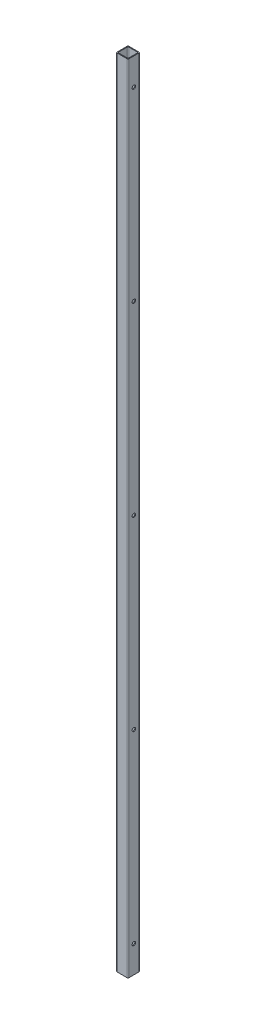
ISO-10303-21;
HEADER;
FILE_DESCRIPTION(('STEP AP214'),'2;1');
FILE_NAME('part.step','',(''),(''),'','','');
FILE_SCHEMA(('AUTOMOTIVE_DESIGN { 1 0 10303 214 1 1 1 1 }'));
ENDSEC;
DATA;
#1=APPLICATION_CONTEXT('core data for automotive mechanical design processes');
#2=APPLICATION_PROTOCOL_DEFINITION('international standard','automotive_design',2000,#1);
#3=PRODUCT_CONTEXT('',#1,'mechanical');
#4=PRODUCT('Part','Part','',(#3));
#5=PRODUCT_RELATED_PRODUCT_CATEGORY('part','',(#4));
#6=PRODUCT_DEFINITION_FORMATION('','',#4);
#7=PRODUCT_DEFINITION_CONTEXT('part definition',#1,'design');
#8=PRODUCT_DEFINITION('design','',#6,#7);
#9=PRODUCT_DEFINITION_SHAPE('','',#8);
#10=(LENGTH_UNIT() NAMED_UNIT(*) SI_UNIT(.MILLI.,.METRE.));
#11=(NAMED_UNIT(*) PLANE_ANGLE_UNIT() SI_UNIT($,.RADIAN.));
#12=(NAMED_UNIT(*) SI_UNIT($,.STERADIAN.) SOLID_ANGLE_UNIT());
#13=UNCERTAINTY_MEASURE_WITH_UNIT(LENGTH_MEASURE(1.E-05),#10,'distance_accuracy_value','');
#14=(GEOMETRIC_REPRESENTATION_CONTEXT(3) GLOBAL_UNCERTAINTY_ASSIGNED_CONTEXT((#13)) GLOBAL_UNIT_ASSIGNED_CONTEXT((#10,
#11,#12)) REPRESENTATION_CONTEXT('',''));
#15=CARTESIAN_POINT('',(0.,0.,0.));
#16=DIRECTION('',(0.,0.,1.));
#17=DIRECTION('',(1.,0.,0.));
#18=AXIS2_PLACEMENT_3D('',#15,#16,#17);
#19=CARTESIAN_POINT('',(0.,1308.1,0.));
#20=DIRECTION('',(0.,-1.,0.));
#21=DIRECTION('',(0.,0.,-1.));
#22=AXIS2_PLACEMENT_3D('',#19,#20,#21);
#23=PLANE('',#22);
#24=DIRECTION('',(0.,0.,1.));
#25=VECTOR('',#24,1.);
#26=CARTESIAN_POINT('',(-9.652,1308.1,9.652));
#27=LINE('',#26,#25);
#28=CARTESIAN_POINT('',(-9.652,1308.1,-8.382));
#29=VERTEX_POINT('',#28);
#30=CARTESIAN_POINT('',(-9.652,1308.1,8.382));
#31=VERTEX_POINT('',#30);
#32=EDGE_CURVE('E181',#29,#31,#27,.T.);
#33=ORIENTED_EDGE('',*,*,#32,.T.);
#34=CARTESIAN_POINT('',(-8.382,1308.1,8.382));
#35=DIRECTION('',(0.,-1.,0.));
#36=DIRECTION('',(0.,0.,-1.));
#37=AXIS2_PLACEMENT_3D('',#34,#35,#36);
#38=CIRCLE('',#37,1.27);
#39=CARTESIAN_POINT('',(-8.382,1308.1,9.652));
#40=VERTEX_POINT('',#39);
#41=EDGE_CURVE('E223',#31,#40,#38,.F.);
#42=ORIENTED_EDGE('',*,*,#41,.T.);
#43=DIRECTION('',(1.,0.,0.));
#44=VECTOR('',#43,1.);
#45=CARTESIAN_POINT('',(-9.652,1308.1,9.652));
#46=LINE('',#45,#44);
#47=CARTESIAN_POINT('',(8.382,1308.1,9.652));
#48=VERTEX_POINT('',#47);
#49=EDGE_CURVE('E176',#40,#48,#46,.T.);
#50=ORIENTED_EDGE('',*,*,#49,.T.);
#51=CARTESIAN_POINT('',(8.382,1308.1,8.382));
#52=DIRECTION('',(0.,-1.,0.));
#53=DIRECTION('',(0.,0.,-1.));
#54=AXIS2_PLACEMENT_3D('',#51,#52,#53);
#55=CIRCLE('',#54,1.27);
#56=CARTESIAN_POINT('',(9.652,1308.1,8.382));
#57=VERTEX_POINT('',#56);
#58=EDGE_CURVE('E218',#48,#57,#55,.F.);
#59=ORIENTED_EDGE('',*,*,#58,.T.);
#60=DIRECTION('',(0.,0.,-1.));
#61=VECTOR('',#60,1.);
#62=CARTESIAN_POINT('',(9.652,1308.1,9.652));
#63=LINE('',#62,#61);
#64=CARTESIAN_POINT('',(9.652,1308.1,-8.382));
#65=VERTEX_POINT('',#64);
#66=EDGE_CURVE('E314',#57,#65,#63,.T.);
#67=ORIENTED_EDGE('',*,*,#66,.T.);
#68=CARTESIAN_POINT('',(8.382,1308.1,-8.382));
#69=DIRECTION('',(0.,-1.,0.));
#70=DIRECTION('',(0.,0.,-1.));
#71=AXIS2_PLACEMENT_3D('',#68,#69,#70);
#72=CIRCLE('',#71,1.27);
#73=CARTESIAN_POINT('',(8.382,1308.1,-9.652));
#74=VERTEX_POINT('',#73);
#75=EDGE_CURVE('E59',#65,#74,#72,.F.);
#76=ORIENTED_EDGE('',*,*,#75,.T.);
#77=DIRECTION('',(-1.,0.,0.));
#78=VECTOR('',#77,1.);
#79=CARTESIAN_POINT('',(-9.652,1308.1,-9.652));
#80=LINE('',#79,#78);
#81=CARTESIAN_POINT('',(-8.382,1308.1,-9.652));
#82=VERTEX_POINT('',#81);
#83=EDGE_CURVE('E316',#74,#82,#80,.T.);
#84=ORIENTED_EDGE('',*,*,#83,.T.);
#85=CARTESIAN_POINT('',(-8.382,1308.1,-8.382));
#86=DIRECTION('',(0.,-1.,0.));
#87=DIRECTION('',(0.,0.,-1.));
#88=AXIS2_PLACEMENT_3D('',#85,#86,#87);
#89=CIRCLE('',#88,1.27);
#90=EDGE_CURVE('E221',#82,#29,#89,.F.);
#91=ORIENTED_EDGE('',*,*,#90,.T.);
#92=EDGE_LOOP('',(#33,#42,#50,#59,#67,#76,#84,#91));
#93=FACE_BOUND('',#92,.T.);
#94=DIRECTION('',(1.,0.,0.));
#95=VECTOR('',#94,1.);
#96=CARTESIAN_POINT('',(-8.382,1308.1,8.382));
#97=LINE('',#96,#95);
#98=CARTESIAN_POINT('',(-7.112,1308.1,8.382));
#99=VERTEX_POINT('',#98);
#100=CARTESIAN_POINT('',(7.112,1308.1,8.382));
#101=VERTEX_POINT('',#100);
#102=EDGE_CURVE('E297',#99,#101,#97,.T.);
#103=ORIENTED_EDGE('',*,*,#102,.F.);
#104=CARTESIAN_POINT('',(-7.112,1308.1,7.112));
#105=DIRECTION('',(0.,-1.,0.));
#106=DIRECTION('',(0.,0.,-1.));
#107=AXIS2_PLACEMENT_3D('',#104,#105,#106);
#108=CIRCLE('',#107,1.27);
#109=CARTESIAN_POINT('',(-8.382,1308.1,7.112));
#110=VERTEX_POINT('',#109);
#111=EDGE_CURVE('E11',#99,#110,#108,.T.);
#112=ORIENTED_EDGE('',*,*,#111,.T.);
#113=DIRECTION('',(0.,0.,1.));
#114=VECTOR('',#113,1.);
#115=CARTESIAN_POINT('',(-8.382,1308.1,8.382));
#116=LINE('',#115,#114);
#117=CARTESIAN_POINT('',(-8.382,1308.1,-7.11199999999999));
#118=VERTEX_POINT('',#117);
#119=EDGE_CURVE('E305',#118,#110,#116,.T.);
#120=ORIENTED_EDGE('',*,*,#119,.F.);
#121=CARTESIAN_POINT('',(-7.112,1308.1,-7.112));
#122=DIRECTION('',(0.,-1.,0.));
#123=DIRECTION('',(0.,0.,-1.));
#124=AXIS2_PLACEMENT_3D('',#121,#122,#123);
#125=CIRCLE('',#124,1.27);
#126=CARTESIAN_POINT('',(-7.112,1308.1,-8.382));
#127=VERTEX_POINT('',#126);
#128=EDGE_CURVE('E236',#118,#127,#125,.T.);
#129=ORIENTED_EDGE('',*,*,#128,.T.);
#130=DIRECTION('',(-1.,0.,0.));
#131=VECTOR('',#130,1.);
#132=CARTESIAN_POINT('',(-8.382,1308.1,-8.382));
#133=LINE('',#132,#131);
#134=CARTESIAN_POINT('',(7.112,1308.1,-8.382));
#135=VERTEX_POINT('',#134);
#136=EDGE_CURVE('E303',#135,#127,#133,.T.);
#137=ORIENTED_EDGE('',*,*,#136,.F.);
#138=CARTESIAN_POINT('',(7.112,1308.1,-7.112));
#139=DIRECTION('',(0.,-1.,0.));
#140=DIRECTION('',(0.,0.,-1.));
#141=AXIS2_PLACEMENT_3D('',#138,#139,#140);
#142=CIRCLE('',#141,1.27);
#143=CARTESIAN_POINT('',(8.382,1308.1,-7.11199999999999));
#144=VERTEX_POINT('',#143);
#145=EDGE_CURVE('E161',#135,#144,#142,.T.);
#146=ORIENTED_EDGE('',*,*,#145,.T.);
#147=DIRECTION('',(0.,0.,-1.));
#148=VECTOR('',#147,1.);
#149=CARTESIAN_POINT('',(8.382,1308.1,8.382));
#150=LINE('',#149,#148);
#151=CARTESIAN_POINT('',(8.382,1308.1,7.112));
#152=VERTEX_POINT('',#151);
#153=EDGE_CURVE('E300',#152,#144,#150,.T.);
#154=ORIENTED_EDGE('',*,*,#153,.F.);
#155=CARTESIAN_POINT('',(7.112,1308.1,7.112));
#156=DIRECTION('',(0.,-1.,0.));
#157=DIRECTION('',(0.,0.,-1.));
#158=AXIS2_PLACEMENT_3D('',#155,#156,#157);
#159=CIRCLE('',#158,1.27);
#160=EDGE_CURVE('E162',#152,#101,#159,.T.);
#161=ORIENTED_EDGE('',*,*,#160,.T.);
#162=EDGE_LOOP('',(#103,#112,#120,#129,#137,#146,#154,#161));
#163=FACE_BOUND('',#162,.T.);
#164=ADVANCED_FACE('F35',(#93,#163),#23,.F.);
#165=CARTESIAN_POINT('',(0.,0.,0.));
#166=DIRECTION('',(0.,-1.,0.));
#167=DIRECTION('',(0.,0.,-1.));
#168=AXIS2_PLACEMENT_3D('',#165,#166,#167);
#169=PLANE('',#168);
#170=DIRECTION('',(1.,0.,0.));
#171=VECTOR('',#170,1.);
#172=CARTESIAN_POINT('',(-9.652,0.,9.652));
#173=LINE('',#172,#171);
#174=CARTESIAN_POINT('',(-8.382,0.,9.652));
#175=VERTEX_POINT('',#174);
#176=CARTESIAN_POINT('',(8.382,0.,9.652));
#177=VERTEX_POINT('',#176);
#178=EDGE_CURVE('E184',#175,#177,#173,.T.);
#179=ORIENTED_EDGE('',*,*,#178,.F.);
#180=CARTESIAN_POINT('',(-8.382,0.,8.382));
#181=DIRECTION('',(0.,-1.,0.));
#182=DIRECTION('',(0.,0.,-1.));
#183=AXIS2_PLACEMENT_3D('',#180,#181,#182);
#184=CIRCLE('',#183,1.27);
#185=CARTESIAN_POINT('',(-9.652,0.,8.382));
#186=VERTEX_POINT('',#185);
#187=EDGE_CURVE('E211',#175,#186,#184,.T.);
#188=ORIENTED_EDGE('',*,*,#187,.T.);
#189=DIRECTION('',(0.,0.,1.));
#190=VECTOR('',#189,1.);
#191=CARTESIAN_POINT('',(-9.652,0.,9.652));
#192=LINE('',#191,#190);
#193=CARTESIAN_POINT('',(-9.652,0.,-8.382));
#194=VERTEX_POINT('',#193);
#195=EDGE_CURVE('E323',#194,#186,#192,.T.);
#196=ORIENTED_EDGE('',*,*,#195,.F.);
#197=CARTESIAN_POINT('',(-8.382,0.,-8.382));
#198=DIRECTION('',(0.,-1.,0.));
#199=DIRECTION('',(0.,0.,-1.));
#200=AXIS2_PLACEMENT_3D('',#197,#198,#199);
#201=CIRCLE('',#200,1.27);
#202=CARTESIAN_POINT('',(-8.382,0.,-9.652));
#203=VERTEX_POINT('',#202);
#204=EDGE_CURVE('E209',#194,#203,#201,.T.);
#205=ORIENTED_EDGE('',*,*,#204,.T.);
#206=DIRECTION('',(-1.,0.,0.));
#207=VECTOR('',#206,1.);
#208=CARTESIAN_POINT('',(-9.652,0.,-9.652));
#209=LINE('',#208,#207);
#210=CARTESIAN_POINT('',(8.382,0.,-9.652));
#211=VERTEX_POINT('',#210);
#212=EDGE_CURVE('E322',#211,#203,#209,.T.);
#213=ORIENTED_EDGE('',*,*,#212,.F.);
#214=CARTESIAN_POINT('',(8.382,0.,-8.382));
#215=DIRECTION('',(0.,-1.,0.));
#216=DIRECTION('',(0.,0.,-1.));
#217=AXIS2_PLACEMENT_3D('',#214,#215,#216);
#218=CIRCLE('',#217,1.27);
#219=CARTESIAN_POINT('',(9.652,0.,-8.382));
#220=VERTEX_POINT('',#219);
#221=EDGE_CURVE('E207',#211,#220,#218,.T.);
#222=ORIENTED_EDGE('',*,*,#221,.T.);
#223=DIRECTION('',(0.,0.,-1.));
#224=VECTOR('',#223,1.);
#225=CARTESIAN_POINT('',(9.652,0.,9.652));
#226=LINE('',#225,#224);
#227=CARTESIAN_POINT('',(9.652,0.,8.382));
#228=VERTEX_POINT('',#227);
#229=EDGE_CURVE('E308',#228,#220,#226,.T.);
#230=ORIENTED_EDGE('',*,*,#229,.F.);
#231=CARTESIAN_POINT('',(8.382,0.,8.382));
#232=DIRECTION('',(0.,-1.,0.));
#233=DIRECTION('',(0.,0.,-1.));
#234=AXIS2_PLACEMENT_3D('',#231,#232,#233);
#235=CIRCLE('',#234,1.27);
#236=EDGE_CURVE('E205',#228,#177,#235,.T.);
#237=ORIENTED_EDGE('',*,*,#236,.T.);
#238=EDGE_LOOP('',(#179,#188,#196,#205,#213,#222,#230,#237));
#239=FACE_BOUND('',#238,.T.);
#240=DIRECTION('',(-1.,0.,0.));
#241=VECTOR('',#240,1.);
#242=CARTESIAN_POINT('',(-8.382,0.,-8.382));
#243=LINE('',#242,#241);
#244=CARTESIAN_POINT('',(7.112,0.,-8.382));
#245=VERTEX_POINT('',#244);
#246=CARTESIAN_POINT('',(-7.112,0.,-8.382));
#247=VERTEX_POINT('',#246);
#248=EDGE_CURVE('E154',#245,#247,#243,.T.);
#249=ORIENTED_EDGE('',*,*,#248,.T.);
#250=CARTESIAN_POINT('',(-7.112,0.,-7.112));
#251=DIRECTION('',(0.,-1.,0.));
#252=DIRECTION('',(0.,0.,-1.));
#253=AXIS2_PLACEMENT_3D('',#250,#251,#252);
#254=CIRCLE('',#253,1.27);
#255=CARTESIAN_POINT('',(-8.382,0.,-7.11199999999999));
#256=VERTEX_POINT('',#255);
#257=EDGE_CURVE('E234',#247,#256,#254,.F.);
#258=ORIENTED_EDGE('',*,*,#257,.T.);
#259=DIRECTION('',(0.,0.,1.));
#260=VECTOR('',#259,1.);
#261=CARTESIAN_POINT('',(-8.382,0.,8.382));
#262=LINE('',#261,#260);
#263=CARTESIAN_POINT('',(-8.382,0.,7.112));
#264=VERTEX_POINT('',#263);
#265=EDGE_CURVE('E172',#256,#264,#262,.T.);
#266=ORIENTED_EDGE('',*,*,#265,.T.);
#267=CARTESIAN_POINT('',(-7.112,0.,7.112));
#268=DIRECTION('',(0.,-1.,0.));
#269=DIRECTION('',(0.,0.,-1.));
#270=AXIS2_PLACEMENT_3D('',#267,#268,#269);
#271=CIRCLE('',#270,1.27);
#272=CARTESIAN_POINT('',(-7.112,0.,8.382));
#273=VERTEX_POINT('',#272);
#274=EDGE_CURVE('E44',#264,#273,#271,.F.);
#275=ORIENTED_EDGE('',*,*,#274,.T.);
#276=DIRECTION('',(1.,0.,0.));
#277=VECTOR('',#276,1.);
#278=CARTESIAN_POINT('',(-8.382,0.,8.382));
#279=LINE('',#278,#277);
#280=CARTESIAN_POINT('',(7.112,0.,8.382));
#281=VERTEX_POINT('',#280);
#282=EDGE_CURVE('E296',#273,#281,#279,.T.);
#283=ORIENTED_EDGE('',*,*,#282,.T.);
#284=CARTESIAN_POINT('',(7.112,0.,7.112));
#285=DIRECTION('',(0.,-1.,0.));
#286=DIRECTION('',(0.,0.,-1.));
#287=AXIS2_PLACEMENT_3D('',#284,#285,#286);
#288=CIRCLE('',#287,1.27);
#289=CARTESIAN_POINT('',(8.382,0.,7.112));
#290=VERTEX_POINT('',#289);
#291=EDGE_CURVE('E238',#281,#290,#288,.F.);
#292=ORIENTED_EDGE('',*,*,#291,.T.);
#293=DIRECTION('',(0.,0.,-1.));
#294=VECTOR('',#293,1.);
#295=CARTESIAN_POINT('',(8.382,0.,8.382));
#296=LINE('',#295,#294);
#297=CARTESIAN_POINT('',(8.382,0.,-7.11199999999999));
#298=VERTEX_POINT('',#297);
#299=EDGE_CURVE('E156',#290,#298,#296,.T.);
#300=ORIENTED_EDGE('',*,*,#299,.T.);
#301=CARTESIAN_POINT('',(7.112,0.,-7.112));
#302=DIRECTION('',(0.,-1.,0.));
#303=DIRECTION('',(0.,0.,-1.));
#304=AXIS2_PLACEMENT_3D('',#301,#302,#303);
#305=CIRCLE('',#304,1.27);
#306=EDGE_CURVE('E151',#298,#245,#305,.F.);
#307=ORIENTED_EDGE('',*,*,#306,.T.);
#308=EDGE_LOOP('',(#249,#258,#266,#275,#283,#292,#300,#307));
#309=FACE_BOUND('',#308,.T.);
#310=ADVANCED_FACE('F153',(#239,#309),#169,.T.);
#311=CARTESIAN_POINT('',(9.652,1308.1,9.652));
#312=DIRECTION('',(-1.,0.,0.));
#313=DIRECTION('',(0.,0.,1.));
#314=AXIS2_PLACEMENT_3D('',#311,#312,#313);
#315=PLANE('',#314);
#316=CARTESIAN_POINT('',(9.652,1263.65,0.));
#317=DIRECTION('',(1.,0.,0.));
#318=DIRECTION('',(0.,0.,-1.));
#319=AXIS2_PLACEMENT_3D('',#316,#317,#318);
#320=CIRCLE('',#319,2.8956);
#321=CARTESIAN_POINT('',(9.652,1263.65,-2.8956));
#322=VERTEX_POINT('',#321);
#323=EDGE_CURVE('E631',#322,#322,#320,.T.);
#324=ORIENTED_EDGE('',*,*,#323,.F.);
#325=EDGE_LOOP('',(#324));
#326=FACE_BOUND('',#325,.T.);
#327=CARTESIAN_POINT('',(9.652,958.85,0.));
#328=DIRECTION('',(1.,0.,0.));
#329=DIRECTION('',(0.,0.,-1.));
#330=AXIS2_PLACEMENT_3D('',#327,#328,#329);
#331=CIRCLE('',#330,2.8956);
#332=CARTESIAN_POINT('',(9.652,958.85,-2.8956));
#333=VERTEX_POINT('',#332);
#334=EDGE_CURVE('E267',#333,#333,#331,.T.);
#335=ORIENTED_EDGE('',*,*,#334,.F.);
#336=EDGE_LOOP('',(#335));
#337=FACE_BOUND('',#336,.T.);
#338=CARTESIAN_POINT('',(9.652,654.05,0.));
#339=DIRECTION('',(1.,0.,0.));
#340=DIRECTION('',(0.,0.,-1.));
#341=AXIS2_PLACEMENT_3D('',#338,#339,#340);
#342=CIRCLE('',#341,2.8956);
#343=CARTESIAN_POINT('',(9.652,654.05,-2.8956));
#344=VERTEX_POINT('',#343);
#345=EDGE_CURVE('E264',#344,#344,#342,.T.);
#346=ORIENTED_EDGE('',*,*,#345,.F.);
#347=EDGE_LOOP('',(#346));
#348=FACE_BOUND('',#347,.T.);
#349=CARTESIAN_POINT('',(9.652,349.25,0.));
#350=DIRECTION('',(1.,0.,0.));
#351=DIRECTION('',(0.,0.,-1.));
#352=AXIS2_PLACEMENT_3D('',#349,#350,#351);
#353=CIRCLE('',#352,2.8956);
#354=CARTESIAN_POINT('',(9.652,349.25,-2.8956));
#355=VERTEX_POINT('',#354);
#356=EDGE_CURVE('E282',#355,#355,#353,.T.);
#357=ORIENTED_EDGE('',*,*,#356,.F.);
#358=EDGE_LOOP('',(#357));
#359=FACE_BOUND('',#358,.T.);
#360=CARTESIAN_POINT('',(9.652,44.4500000000001,0.));
#361=DIRECTION('',(1.,0.,0.));
#362=DIRECTION('',(0.,0.,-1.));
#363=AXIS2_PLACEMENT_3D('',#360,#361,#362);
#364=CIRCLE('',#363,2.89559999999998);
#365=CARTESIAN_POINT('',(9.652,44.4500000000001,-2.89559999999999));
#366=VERTEX_POINT('',#365);
#367=EDGE_CURVE('E289',#366,#366,#364,.T.);
#368=ORIENTED_EDGE('',*,*,#367,.F.);
#369=EDGE_LOOP('',(#368));
#370=FACE_BOUND('',#369,.T.);
#371=ORIENTED_EDGE('',*,*,#229,.T.);
#372=DIRECTION('',(0.,-1.,0.));
#373=VECTOR('',#372,1.);
#374=CARTESIAN_POINT('',(9.652,1308.1,-8.382));
#375=LINE('',#374,#373);
#376=EDGE_CURVE('E232',#220,#65,#375,.F.);
#377=ORIENTED_EDGE('',*,*,#376,.T.);
#378=ORIENTED_EDGE('',*,*,#66,.F.);
#379=DIRECTION('',(0.,-1.,0.));
#380=VECTOR('',#379,1.);
#381=CARTESIAN_POINT('',(9.652,1308.1,8.382));
#382=LINE('',#381,#380);
#383=EDGE_CURVE('E229',#57,#228,#382,.T.);
#384=ORIENTED_EDGE('',*,*,#383,.T.);
#385=EDGE_LOOP('',(#371,#377,#378,#384));
#386=FACE_BOUND('',#385,.T.);
#387=ADVANCED_FACE('F342',(#326,#337,#348,#359,#370,#386),#315,.F.);
#388=CARTESIAN_POINT('',(-9.652,1308.1,-9.652));
#389=DIRECTION('',(0.,0.,1.));
#390=DIRECTION('',(1.,0.,0.));
#391=AXIS2_PLACEMENT_3D('',#388,#389,#390);
#392=PLANE('',#391);
#393=ORIENTED_EDGE('',*,*,#212,.T.);
#394=DIRECTION('',(0.,-1.,0.));
#395=VECTOR('',#394,1.);
#396=CARTESIAN_POINT('',(-8.382,1308.1,-9.652));
#397=LINE('',#396,#395);
#398=EDGE_CURVE('E52',#203,#82,#397,.F.);
#399=ORIENTED_EDGE('',*,*,#398,.T.);
#400=ORIENTED_EDGE('',*,*,#83,.F.);
#401=DIRECTION('',(0.,-1.,0.));
#402=VECTOR('',#401,1.);
#403=CARTESIAN_POINT('',(8.382,1308.1,-9.652));
#404=LINE('',#403,#402);
#405=EDGE_CURVE('E225',#74,#211,#404,.T.);
#406=ORIENTED_EDGE('',*,*,#405,.T.);
#407=EDGE_LOOP('',(#393,#399,#400,#406));
#408=FACE_BOUND('',#407,.T.);
#409=ADVANCED_FACE('F349',(#408),#392,.F.);
#410=CARTESIAN_POINT('',(-9.652,1308.1,9.652));
#411=DIRECTION('',(1.,0.,0.));
#412=DIRECTION('',(0.,0.,-1.));
#413=AXIS2_PLACEMENT_3D('',#410,#411,#412);
#414=PLANE('',#413);
#415=CARTESIAN_POINT('',(-9.652,1263.65,0.));
#416=DIRECTION('',(1.,0.,0.));
#417=DIRECTION('',(0.,0.,-1.));
#418=AXIS2_PLACEMENT_3D('',#415,#416,#417);
#419=CIRCLE('',#418,2.8956);
#420=CARTESIAN_POINT('',(-9.652,1263.65,-2.8956));
#421=VERTEX_POINT('',#420);
#422=EDGE_CURVE('E632',#421,#421,#419,.T.);
#423=ORIENTED_EDGE('',*,*,#422,.T.);
#424=EDGE_LOOP('',(#423));
#425=FACE_BOUND('',#424,.T.);
#426=CARTESIAN_POINT('',(-9.652,958.85,0.));
#427=DIRECTION('',(1.,0.,0.));
#428=DIRECTION('',(0.,0.,-1.));
#429=AXIS2_PLACEMENT_3D('',#426,#427,#428);
#430=CIRCLE('',#429,2.8956);
#431=CARTESIAN_POINT('',(-9.652,958.85,-2.8956));
#432=VERTEX_POINT('',#431);
#433=EDGE_CURVE('E260',#432,#432,#430,.T.);
#434=ORIENTED_EDGE('',*,*,#433,.T.);
#435=EDGE_LOOP('',(#434));
#436=FACE_BOUND('',#435,.T.);
#437=CARTESIAN_POINT('',(-9.652,654.05,0.));
#438=DIRECTION('',(1.,0.,0.));
#439=DIRECTION('',(0.,0.,-1.));
#440=AXIS2_PLACEMENT_3D('',#437,#438,#439);
#441=CIRCLE('',#440,2.8956);
#442=CARTESIAN_POINT('',(-9.652,654.05,-2.8956));
#443=VERTEX_POINT('',#442);
#444=EDGE_CURVE('E256',#443,#443,#441,.T.);
#445=ORIENTED_EDGE('',*,*,#444,.T.);
#446=EDGE_LOOP('',(#445));
#447=FACE_BOUND('',#446,.T.);
#448=CARTESIAN_POINT('',(-9.652,349.25,0.));
#449=DIRECTION('',(1.,0.,0.));
#450=DIRECTION('',(0.,0.,-1.));
#451=AXIS2_PLACEMENT_3D('',#448,#449,#450);
#452=CIRCLE('',#451,2.8956);
#453=CARTESIAN_POINT('',(-9.652,349.25,-2.8956));
#454=VERTEX_POINT('',#453);
#455=EDGE_CURVE('E252',#454,#454,#452,.T.);
#456=ORIENTED_EDGE('',*,*,#455,.T.);
#457=EDGE_LOOP('',(#456));
#458=FACE_BOUND('',#457,.T.);
#459=CARTESIAN_POINT('',(-9.652,44.4500000000001,0.));
#460=DIRECTION('',(1.,0.,0.));
#461=DIRECTION('',(0.,0.,-1.));
#462=AXIS2_PLACEMENT_3D('',#459,#460,#461);
#463=CIRCLE('',#462,2.89559999999998);
#464=CARTESIAN_POINT('',(-9.652,44.4500000000001,-2.89559999999999));
#465=VERTEX_POINT('',#464);
#466=EDGE_CURVE('E247',#465,#465,#463,.T.);
#467=ORIENTED_EDGE('',*,*,#466,.T.);
#468=EDGE_LOOP('',(#467));
#469=FACE_BOUND('',#468,.T.);
#470=ORIENTED_EDGE('',*,*,#195,.T.);
#471=DIRECTION('',(0.,-1.,0.));
#472=VECTOR('',#471,1.);
#473=CARTESIAN_POINT('',(-9.652,1308.1,8.382));
#474=LINE('',#473,#472);
#475=EDGE_CURVE('E216',#186,#31,#474,.F.);
#476=ORIENTED_EDGE('',*,*,#475,.T.);
#477=ORIENTED_EDGE('',*,*,#32,.F.);
#478=DIRECTION('',(0.,-1.,0.));
#479=VECTOR('',#478,1.);
#480=CARTESIAN_POINT('',(-9.652,1308.1,-8.382));
#481=LINE('',#480,#479);
#482=EDGE_CURVE('E213',#29,#194,#481,.T.);
#483=ORIENTED_EDGE('',*,*,#482,.T.);
#484=EDGE_LOOP('',(#470,#476,#477,#483));
#485=FACE_BOUND('',#484,.T.);
#486=ADVANCED_FACE('F355',(#425,#436,#447,#458,#469,#485),#414,.F.);
#487=CARTESIAN_POINT('',(-9.652,1308.1,9.652));
#488=DIRECTION('',(0.,0.,-1.));
#489=DIRECTION('',(-1.,0.,0.));
#490=AXIS2_PLACEMENT_3D('',#487,#488,#489);
#491=PLANE('',#490);
#492=ORIENTED_EDGE('',*,*,#49,.F.);
#493=DIRECTION('',(0.,-1.,0.));
#494=VECTOR('',#493,1.);
#495=CARTESIAN_POINT('',(-8.382,1308.1,9.652));
#496=LINE('',#495,#494);
#497=EDGE_CURVE('E202',#40,#175,#496,.T.);
#498=ORIENTED_EDGE('',*,*,#497,.T.);
#499=ORIENTED_EDGE('',*,*,#178,.T.);
#500=DIRECTION('',(0.,-1.,0.));
#501=VECTOR('',#500,1.);
#502=CARTESIAN_POINT('',(8.382,1308.1,9.652));
#503=LINE('',#502,#501);
#504=EDGE_CURVE('E200',#177,#48,#503,.F.);
#505=ORIENTED_EDGE('',*,*,#504,.T.);
#506=EDGE_LOOP('',(#492,#498,#499,#505));
#507=FACE_BOUND('',#506,.T.);
#508=ADVANCED_FACE('F333',(#507),#491,.F.);
#509=CARTESIAN_POINT('',(-8.382,1308.1,8.382));
#510=DIRECTION('',(0.,0.,-1.));
#511=DIRECTION('',(-1.,0.,0.));
#512=AXIS2_PLACEMENT_3D('',#509,#510,#511);
#513=PLANE('',#512);
#514=ORIENTED_EDGE('',*,*,#102,.T.);
#515=DIRECTION('',(0.,-1.,0.));
#516=VECTOR('',#515,1.);
#517=CARTESIAN_POINT('',(7.112,0.,8.382));
#518=LINE('',#517,#516);
#519=EDGE_CURVE('E193',#101,#281,#518,.T.);
#520=ORIENTED_EDGE('',*,*,#519,.T.);
#521=ORIENTED_EDGE('',*,*,#282,.F.);
#522=DIRECTION('',(0.,-1.,0.));
#523=VECTOR('',#522,1.);
#524=CARTESIAN_POINT('',(-7.112,1308.1,8.382));
#525=LINE('',#524,#523);
#526=EDGE_CURVE('E191',#273,#99,#525,.F.);
#527=ORIENTED_EDGE('',*,*,#526,.T.);
#528=EDGE_LOOP('',(#514,#520,#521,#527));
#529=FACE_BOUND('',#528,.T.);
#530=ADVANCED_FACE('F376',(#529),#513,.T.);
#531=CARTESIAN_POINT('',(8.382,1308.1,8.382));
#532=DIRECTION('',(-1.,0.,0.));
#533=DIRECTION('',(0.,0.,1.));
#534=AXIS2_PLACEMENT_3D('',#531,#532,#533);
#535=PLANE('',#534);
#536=CARTESIAN_POINT('',(8.382,1263.65,0.));
#537=DIRECTION('',(-1.,0.,0.));
#538=DIRECTION('',(0.,0.,1.));
#539=AXIS2_PLACEMENT_3D('',#536,#537,#538);
#540=CIRCLE('',#539,2.8956);
#541=CARTESIAN_POINT('',(8.382,1263.65,2.89559999999999));
#542=VERTEX_POINT('',#541);
#543=EDGE_CURVE('E272',#542,#542,#540,.T.);
#544=ORIENTED_EDGE('',*,*,#543,.F.);
#545=EDGE_LOOP('',(#544));
#546=FACE_BOUND('',#545,.T.);
#547=CARTESIAN_POINT('',(8.382,958.85,0.));
#548=DIRECTION('',(-1.,0.,0.));
#549=DIRECTION('',(0.,0.,1.));
#550=AXIS2_PLACEMENT_3D('',#547,#548,#549);
#551=CIRCLE('',#550,2.8956);
#552=CARTESIAN_POINT('',(8.382,958.85,2.89559999999999));
#553=VERTEX_POINT('',#552);
#554=EDGE_CURVE('E257',#553,#553,#551,.T.);
#555=ORIENTED_EDGE('',*,*,#554,.F.);
#556=EDGE_LOOP('',(#555));
#557=FACE_BOUND('',#556,.T.);
#558=CARTESIAN_POINT('',(8.382,654.05,0.));
#559=DIRECTION('',(-1.,0.,0.));
#560=DIRECTION('',(0.,0.,1.));
#561=AXIS2_PLACEMENT_3D('',#558,#559,#560);
#562=CIRCLE('',#561,2.8956);
#563=CARTESIAN_POINT('',(8.382,654.05,2.89559999999999));
#564=VERTEX_POINT('',#563);
#565=EDGE_CURVE('E255',#564,#564,#562,.T.);
#566=ORIENTED_EDGE('',*,*,#565,.F.);
#567=EDGE_LOOP('',(#566));
#568=FACE_BOUND('',#567,.T.);
#569=CARTESIAN_POINT('',(8.382,349.25,0.));
#570=DIRECTION('',(-1.,0.,0.));
#571=DIRECTION('',(0.,0.,1.));
#572=AXIS2_PLACEMENT_3D('',#569,#570,#571);
#573=CIRCLE('',#572,2.8956);
#574=CARTESIAN_POINT('',(8.382,349.25,2.89559999999999));
#575=VERTEX_POINT('',#574);
#576=EDGE_CURVE('E248',#575,#575,#573,.T.);
#577=ORIENTED_EDGE('',*,*,#576,.F.);
#578=EDGE_LOOP('',(#577));
#579=FACE_BOUND('',#578,.T.);
#580=CARTESIAN_POINT('',(8.382,44.4500000000001,0.));
#581=DIRECTION('',(-1.,0.,0.));
#582=DIRECTION('',(0.,0.,1.));
#583=AXIS2_PLACEMENT_3D('',#580,#581,#582);
#584=CIRCLE('',#583,2.89559999999998);
#585=CARTESIAN_POINT('',(8.382,44.4500000000001,2.89559999999998));
#586=VERTEX_POINT('',#585);
#587=EDGE_CURVE('E246',#586,#586,#584,.T.);
#588=ORIENTED_EDGE('',*,*,#587,.F.);
#589=EDGE_LOOP('',(#588));
#590=FACE_BOUND('',#589,.T.);
#591=ORIENTED_EDGE('',*,*,#299,.F.);
#592=DIRECTION('',(0.,-1.,0.));
#593=VECTOR('',#592,1.);
#594=CARTESIAN_POINT('',(8.382,1308.1,7.112));
#595=LINE('',#594,#593);
#596=EDGE_CURVE('E198',#290,#152,#595,.F.);
#597=ORIENTED_EDGE('',*,*,#596,.T.);
#598=ORIENTED_EDGE('',*,*,#153,.T.);
#599=DIRECTION('',(0.,-1.,0.));
#600=VECTOR('',#599,1.);
#601=CARTESIAN_POINT('',(8.382,0.,-7.112));
#602=LINE('',#601,#600);
#603=EDGE_CURVE('E196',#144,#298,#602,.T.);
#604=ORIENTED_EDGE('',*,*,#603,.T.);
#605=EDGE_LOOP('',(#591,#597,#598,#604));
#606=FACE_BOUND('',#605,.T.);
#607=ADVANCED_FACE('F460',(#546,#557,#568,#579,#590,#606),#535,.T.);
#608=CARTESIAN_POINT('',(-8.382,1308.1,-8.382));
#609=DIRECTION('',(0.,0.,1.));
#610=DIRECTION('',(1.,0.,0.));
#611=AXIS2_PLACEMENT_3D('',#608,#609,#610);
#612=PLANE('',#611);
#613=ORIENTED_EDGE('',*,*,#136,.T.);
#614=DIRECTION('',(0.,-1.,0.));
#615=VECTOR('',#614,1.);
#616=CARTESIAN_POINT('',(-7.112,0.,-8.382));
#617=LINE('',#616,#615);
#618=EDGE_CURVE('E171',#127,#247,#617,.T.);
#619=ORIENTED_EDGE('',*,*,#618,.T.);
#620=ORIENTED_EDGE('',*,*,#248,.F.);
#621=DIRECTION('',(0.,-1.,0.));
#622=VECTOR('',#621,1.);
#623=CARTESIAN_POINT('',(7.112,1308.1,-8.382));
#624=LINE('',#623,#622);
#625=EDGE_CURVE('E168',#245,#135,#624,.F.);
#626=ORIENTED_EDGE('',*,*,#625,.T.);
#627=EDGE_LOOP('',(#613,#619,#620,#626));
#628=FACE_BOUND('',#627,.T.);
#629=ADVANCED_FACE('F167',(#628),#612,.T.);
#630=CARTESIAN_POINT('',(-8.382,1308.1,8.382));
#631=DIRECTION('',(1.,0.,0.));
#632=DIRECTION('',(0.,0.,-1.));
#633=AXIS2_PLACEMENT_3D('',#630,#631,#632);
#634=PLANE('',#633);
#635=CARTESIAN_POINT('',(-8.382,1263.65,0.));
#636=DIRECTION('',(1.,0.,0.));
#637=DIRECTION('',(0.,0.,-1.));
#638=AXIS2_PLACEMENT_3D('',#635,#636,#637);
#639=CIRCLE('',#638,2.8956);
#640=CARTESIAN_POINT('',(-8.382,1263.65,-2.8956));
#641=VERTEX_POINT('',#640);
#642=EDGE_CURVE('E39',#641,#641,#639,.T.);
#643=ORIENTED_EDGE('',*,*,#642,.F.);
#644=EDGE_LOOP('',(#643));
#645=FACE_BOUND('',#644,.T.);
#646=CARTESIAN_POINT('',(-8.382,958.85,0.));
#647=DIRECTION('',(1.,0.,0.));
#648=DIRECTION('',(0.,0.,-1.));
#649=AXIS2_PLACEMENT_3D('',#646,#647,#648);
#650=CIRCLE('',#649,2.8956);
#651=CARTESIAN_POINT('',(-8.382,958.85,-2.8956));
#652=VERTEX_POINT('',#651);
#653=EDGE_CURVE('E259',#652,#652,#650,.T.);
#654=ORIENTED_EDGE('',*,*,#653,.F.);
#655=EDGE_LOOP('',(#654));
#656=FACE_BOUND('',#655,.T.);
#657=CARTESIAN_POINT('',(-8.382,654.05,0.));
#658=DIRECTION('',(1.,0.,0.));
#659=DIRECTION('',(0.,0.,-1.));
#660=AXIS2_PLACEMENT_3D('',#657,#658,#659);
#661=CIRCLE('',#660,2.8956);
#662=CARTESIAN_POINT('',(-8.382,654.05,-2.8956));
#663=VERTEX_POINT('',#662);
#664=EDGE_CURVE('E253',#663,#663,#661,.T.);
#665=ORIENTED_EDGE('',*,*,#664,.F.);
#666=EDGE_LOOP('',(#665));
#667=FACE_BOUND('',#666,.T.);
#668=CARTESIAN_POINT('',(-8.382,349.25,0.));
#669=DIRECTION('',(1.,0.,0.));
#670=DIRECTION('',(0.,0.,-1.));
#671=AXIS2_PLACEMENT_3D('',#668,#669,#670);
#672=CIRCLE('',#671,2.8956);
#673=CARTESIAN_POINT('',(-8.382,349.25,-2.8956));
#674=VERTEX_POINT('',#673);
#675=EDGE_CURVE('E251',#674,#674,#672,.T.);
#676=ORIENTED_EDGE('',*,*,#675,.F.);
#677=EDGE_LOOP('',(#676));
#678=FACE_BOUND('',#677,.T.);
#679=CARTESIAN_POINT('',(-8.382,44.4500000000001,0.));
#680=DIRECTION('',(1.,0.,0.));
#681=DIRECTION('',(0.,0.,-1.));
#682=AXIS2_PLACEMENT_3D('',#679,#680,#681);
#683=CIRCLE('',#682,2.89559999999998);
#684=CARTESIAN_POINT('',(-8.382,44.4500000000001,-2.89559999999999));
#685=VERTEX_POINT('',#684);
#686=EDGE_CURVE('E243',#685,#685,#683,.T.);
#687=ORIENTED_EDGE('',*,*,#686,.F.);
#688=EDGE_LOOP('',(#687));
#689=FACE_BOUND('',#688,.T.);
#690=ORIENTED_EDGE('',*,*,#265,.F.);
#691=DIRECTION('',(0.,-1.,0.));
#692=VECTOR('',#691,1.);
#693=CARTESIAN_POINT('',(-8.382,1308.1,-7.112));
#694=LINE('',#693,#692);
#695=EDGE_CURVE('E189',#256,#118,#694,.F.);
#696=ORIENTED_EDGE('',*,*,#695,.T.);
#697=ORIENTED_EDGE('',*,*,#119,.T.);
#698=DIRECTION('',(0.,-1.,0.));
#699=VECTOR('',#698,1.);
#700=CARTESIAN_POINT('',(-8.382,0.,7.112));
#701=LINE('',#700,#699);
#702=EDGE_CURVE('E178',#110,#264,#701,.T.);
#703=ORIENTED_EDGE('',*,*,#702,.T.);
#704=EDGE_LOOP('',(#690,#696,#697,#703));
#705=FACE_BOUND('',#704,.T.);
#706=ADVANCED_FACE('F393',(#645,#656,#667,#678,#689,#705),#634,.T.);
#707=CARTESIAN_POINT('',(-7.112,1308.1,-7.112));
#708=DIRECTION('',(0.,1.,0.));
#709=DIRECTION('',(0.,0.,1.));
#710=AXIS2_PLACEMENT_3D('',#707,#708,#709);
#711=CYLINDRICAL_SURFACE('',#710,1.27);
#712=ORIENTED_EDGE('',*,*,#128,.F.);
#713=ORIENTED_EDGE('',*,*,#695,.F.);
#714=ORIENTED_EDGE('',*,*,#257,.F.);
#715=ORIENTED_EDGE('',*,*,#618,.F.);
#716=EDGE_LOOP('',(#712,#713,#714,#715));
#717=FACE_BOUND('',#716,.T.);
#718=ADVANCED_FACE('F389',(#717),#711,.F.);
#719=CARTESIAN_POINT('',(7.112,1308.1,7.112));
#720=DIRECTION('',(0.,1.,0.));
#721=DIRECTION('',(0.,0.,1.));
#722=AXIS2_PLACEMENT_3D('',#719,#720,#721);
#723=CYLINDRICAL_SURFACE('',#722,1.27);
#724=ORIENTED_EDGE('',*,*,#160,.F.);
#725=ORIENTED_EDGE('',*,*,#596,.F.);
#726=ORIENTED_EDGE('',*,*,#291,.F.);
#727=ORIENTED_EDGE('',*,*,#519,.F.);
#728=EDGE_LOOP('',(#724,#725,#726,#727));
#729=FACE_BOUND('',#728,.T.);
#730=ADVANCED_FACE('F392',(#729),#723,.F.);
#731=CARTESIAN_POINT('',(7.112,1308.1,-7.112));
#732=DIRECTION('',(0.,1.,0.));
#733=DIRECTION('',(0.,0.,1.));
#734=AXIS2_PLACEMENT_3D('',#731,#732,#733);
#735=CYLINDRICAL_SURFACE('',#734,1.27);
#736=ORIENTED_EDGE('',*,*,#145,.F.);
#737=ORIENTED_EDGE('',*,*,#625,.F.);
#738=ORIENTED_EDGE('',*,*,#306,.F.);
#739=ORIENTED_EDGE('',*,*,#603,.F.);
#740=EDGE_LOOP('',(#736,#737,#738,#739));
#741=FACE_BOUND('',#740,.T.);
#742=ADVANCED_FACE('F175',(#741),#735,.F.);
#743=CARTESIAN_POINT('',(-7.112,1308.1,7.112));
#744=DIRECTION('',(0.,1.,0.));
#745=DIRECTION('',(0.,0.,1.));
#746=AXIS2_PLACEMENT_3D('',#743,#744,#745);
#747=CYLINDRICAL_SURFACE('',#746,1.27);
#748=ORIENTED_EDGE('',*,*,#111,.F.);
#749=ORIENTED_EDGE('',*,*,#526,.F.);
#750=ORIENTED_EDGE('',*,*,#274,.F.);
#751=ORIENTED_EDGE('',*,*,#702,.F.);
#752=EDGE_LOOP('',(#748,#749,#750,#751));
#753=FACE_BOUND('',#752,.T.);
#754=ADVANCED_FACE('F360',(#753),#747,.F.);
#755=CARTESIAN_POINT('',(-8.382,1308.1,8.382));
#756=DIRECTION('',(0.,-1.,0.));
#757=DIRECTION('',(0.,0.,-1.));
#758=AXIS2_PLACEMENT_3D('',#755,#756,#757);
#759=CYLINDRICAL_SURFACE('',#758,1.27);
#760=ORIENTED_EDGE('',*,*,#41,.F.);
#761=ORIENTED_EDGE('',*,*,#475,.F.);
#762=ORIENTED_EDGE('',*,*,#187,.F.);
#763=ORIENTED_EDGE('',*,*,#497,.F.);
#764=EDGE_LOOP('',(#760,#761,#762,#763));
#765=FACE_BOUND('',#764,.T.);
#766=ADVANCED_FACE('F358',(#765),#759,.T.);
#767=CARTESIAN_POINT('',(-8.382,1308.1,-8.382));
#768=DIRECTION('',(0.,-1.,0.));
#769=DIRECTION('',(0.,0.,-1.));
#770=AXIS2_PLACEMENT_3D('',#767,#768,#769);
#771=CYLINDRICAL_SURFACE('',#770,1.27);
#772=ORIENTED_EDGE('',*,*,#90,.F.);
#773=ORIENTED_EDGE('',*,*,#398,.F.);
#774=ORIENTED_EDGE('',*,*,#204,.F.);
#775=ORIENTED_EDGE('',*,*,#482,.F.);
#776=EDGE_LOOP('',(#772,#773,#774,#775));
#777=FACE_BOUND('',#776,.T.);
#778=ADVANCED_FACE('F353',(#777),#771,.T.);
#779=CARTESIAN_POINT('',(8.382,1308.1,-8.382));
#780=DIRECTION('',(0.,-1.,0.));
#781=DIRECTION('',(0.,0.,-1.));
#782=AXIS2_PLACEMENT_3D('',#779,#780,#781);
#783=CYLINDRICAL_SURFACE('',#782,1.27);
#784=ORIENTED_EDGE('',*,*,#75,.F.);
#785=ORIENTED_EDGE('',*,*,#376,.F.);
#786=ORIENTED_EDGE('',*,*,#221,.F.);
#787=ORIENTED_EDGE('',*,*,#405,.F.);
#788=EDGE_LOOP('',(#784,#785,#786,#787));
#789=FACE_BOUND('',#788,.T.);
#790=ADVANCED_FACE('F346',(#789),#783,.T.);
#791=CARTESIAN_POINT('',(8.382,1308.1,8.382));
#792=DIRECTION('',(0.,-1.,0.));
#793=DIRECTION('',(0.,0.,-1.));
#794=AXIS2_PLACEMENT_3D('',#791,#792,#793);
#795=CYLINDRICAL_SURFACE('',#794,1.27);
#796=ORIENTED_EDGE('',*,*,#58,.F.);
#797=ORIENTED_EDGE('',*,*,#504,.F.);
#798=ORIENTED_EDGE('',*,*,#236,.F.);
#799=ORIENTED_EDGE('',*,*,#383,.F.);
#800=EDGE_LOOP('',(#796,#797,#798,#799));
#801=FACE_BOUND('',#800,.T.);
#802=ADVANCED_FACE('F37',(#801),#795,.T.);
#803=CARTESIAN_POINT('',(9.652,44.4500000000001,0.));
#804=DIRECTION('',(1.,0.,0.));
#805=DIRECTION('',(0.,0.,-1.));
#806=AXIS2_PLACEMENT_3D('',#803,#804,#805);
#807=CYLINDRICAL_SURFACE('',#806,2.89559999999998);
#808=ORIENTED_EDGE('',*,*,#686,.T.);
#809=EDGE_LOOP('',(#808));
#810=FACE_BOUND('',#809,.T.);
#811=ORIENTED_EDGE('',*,*,#466,.F.);
#812=EDGE_LOOP('',(#811));
#813=FACE_BOUND('',#812,.T.);
#814=ADVANCED_FACE('F433',(#810,#813),#807,.F.);
#815=ORIENTED_EDGE('',*,*,#587,.T.);
#816=EDGE_LOOP('',(#815));
#817=FACE_BOUND('',#816,.T.);
#818=ORIENTED_EDGE('',*,*,#367,.T.);
#819=EDGE_LOOP('',(#818));
#820=FACE_BOUND('',#819,.T.);
#821=ADVANCED_FACE('F539',(#817,#820),#807,.F.);
#822=CARTESIAN_POINT('',(9.652,349.25,0.));
#823=DIRECTION('',(1.,0.,0.));
#824=DIRECTION('',(0.,0.,-1.));
#825=AXIS2_PLACEMENT_3D('',#822,#823,#824);
#826=CYLINDRICAL_SURFACE('',#825,2.8956);
#827=ORIENTED_EDGE('',*,*,#576,.T.);
#828=EDGE_LOOP('',(#827));
#829=FACE_BOUND('',#828,.T.);
#830=ORIENTED_EDGE('',*,*,#356,.T.);
#831=EDGE_LOOP('',(#830));
#832=FACE_BOUND('',#831,.T.);
#833=ADVANCED_FACE('F548',(#829,#832),#826,.F.);
#834=ORIENTED_EDGE('',*,*,#675,.T.);
#835=EDGE_LOOP('',(#834));
#836=FACE_BOUND('',#835,.T.);
#837=ORIENTED_EDGE('',*,*,#455,.F.);
#838=EDGE_LOOP('',(#837));
#839=FACE_BOUND('',#838,.T.);
#840=ADVANCED_FACE('F556',(#836,#839),#826,.F.);
#841=CARTESIAN_POINT('',(9.652,654.05,0.));
#842=DIRECTION('',(1.,0.,0.));
#843=DIRECTION('',(0.,0.,-1.));
#844=AXIS2_PLACEMENT_3D('',#841,#842,#843);
#845=CYLINDRICAL_SURFACE('',#844,2.8956);
#846=ORIENTED_EDGE('',*,*,#664,.T.);
#847=EDGE_LOOP('',(#846));
#848=FACE_BOUND('',#847,.T.);
#849=ORIENTED_EDGE('',*,*,#444,.F.);
#850=EDGE_LOOP('',(#849));
#851=FACE_BOUND('',#850,.T.);
#852=ADVANCED_FACE('F565',(#848,#851),#845,.F.);
#853=ORIENTED_EDGE('',*,*,#565,.T.);
#854=EDGE_LOOP('',(#853));
#855=FACE_BOUND('',#854,.T.);
#856=ORIENTED_EDGE('',*,*,#345,.T.);
#857=EDGE_LOOP('',(#856));
#858=FACE_BOUND('',#857,.T.);
#859=ADVANCED_FACE('F573',(#855,#858),#845,.F.);
#860=CARTESIAN_POINT('',(9.652,958.85,0.));
#861=DIRECTION('',(1.,0.,0.));
#862=DIRECTION('',(0.,0.,-1.));
#863=AXIS2_PLACEMENT_3D('',#860,#861,#862);
#864=CYLINDRICAL_SURFACE('',#863,2.8956);
#865=ORIENTED_EDGE('',*,*,#554,.T.);
#866=EDGE_LOOP('',(#865));
#867=FACE_BOUND('',#866,.T.);
#868=ORIENTED_EDGE('',*,*,#334,.T.);
#869=EDGE_LOOP('',(#868));
#870=FACE_BOUND('',#869,.T.);
#871=ADVANCED_FACE('F582',(#867,#870),#864,.F.);
#872=ORIENTED_EDGE('',*,*,#653,.T.);
#873=EDGE_LOOP('',(#872));
#874=FACE_BOUND('',#873,.T.);
#875=ORIENTED_EDGE('',*,*,#433,.F.);
#876=EDGE_LOOP('',(#875));
#877=FACE_BOUND('',#876,.T.);
#878=ADVANCED_FACE('F590',(#874,#877),#864,.F.);
#879=CARTESIAN_POINT('',(9.652,1263.65,0.));
#880=DIRECTION('',(1.,0.,0.));
#881=DIRECTION('',(0.,0.,-1.));
#882=AXIS2_PLACEMENT_3D('',#879,#880,#881);
#883=CYLINDRICAL_SURFACE('',#882,2.8956);
#884=ORIENTED_EDGE('',*,*,#642,.T.);
#885=EDGE_LOOP('',(#884));
#886=FACE_BOUND('',#885,.T.);
#887=ORIENTED_EDGE('',*,*,#422,.F.);
#888=EDGE_LOOP('',(#887));
#889=FACE_BOUND('',#888,.T.);
#890=ADVANCED_FACE('F598',(#886,#889),#883,.F.);
#891=ORIENTED_EDGE('',*,*,#543,.T.);
#892=EDGE_LOOP('',(#891));
#893=FACE_BOUND('',#892,.T.);
#894=ORIENTED_EDGE('',*,*,#323,.T.);
#895=EDGE_LOOP('',(#894));
#896=FACE_BOUND('',#895,.T.);
#897=ADVANCED_FACE('F606',(#893,#896),#883,.F.);
#898=CLOSED_SHELL('',(#164,#310,#387,#409,#486,#508,#530,#607,#629,#706,#718,#730,#742,#754,
#766,#778,#790,#802,#814,#821,#833,#840,#852,#859,#871,#878,#890,#897));
#899=MANIFOLD_SOLID_BREP('B2',#898);
#900=ADVANCED_BREP_SHAPE_REPRESENTATION('',(#18,#899),#14);
#901=SHAPE_DEFINITION_REPRESENTATION(#9,#900);
ENDSEC;
END-ISO-10303-21;
